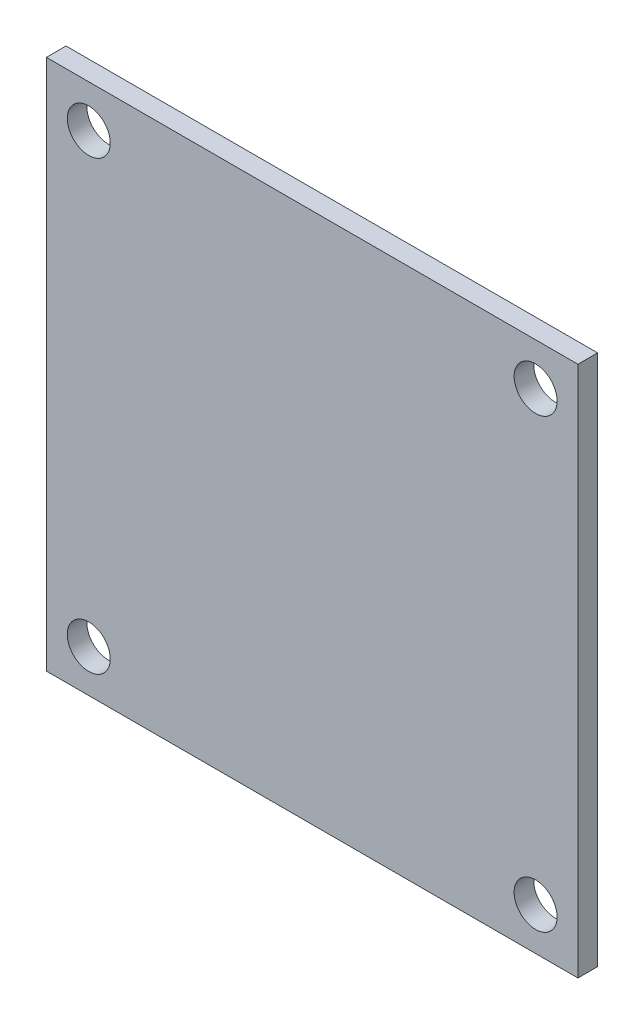
ISO-10303-21;
HEADER;
FILE_DESCRIPTION(('STEP AP214'),'2;1');
FILE_NAME('part.step','',(''),(''),'','','');
FILE_SCHEMA(('AUTOMOTIVE_DESIGN { 1 0 10303 214 1 1 1 1 }'));
ENDSEC;
DATA;
#1=APPLICATION_CONTEXT('core data for automotive mechanical design processes');
#2=APPLICATION_PROTOCOL_DEFINITION('international standard','automotive_design',2000,#1);
#3=PRODUCT_CONTEXT('',#1,'mechanical');
#4=PRODUCT('Part','Part','',(#3));
#5=PRODUCT_RELATED_PRODUCT_CATEGORY('part','',(#4));
#6=PRODUCT_DEFINITION_FORMATION('','',#4);
#7=PRODUCT_DEFINITION_CONTEXT('part definition',#1,'design');
#8=PRODUCT_DEFINITION('design','',#6,#7);
#9=PRODUCT_DEFINITION_SHAPE('','',#8);
#10=(LENGTH_UNIT() NAMED_UNIT(*) SI_UNIT(.MILLI.,.METRE.));
#11=(NAMED_UNIT(*) PLANE_ANGLE_UNIT() SI_UNIT($,.RADIAN.));
#12=(NAMED_UNIT(*) SI_UNIT($,.STERADIAN.) SOLID_ANGLE_UNIT());
#13=UNCERTAINTY_MEASURE_WITH_UNIT(LENGTH_MEASURE(1.E-05),#10,'distance_accuracy_value','');
#14=(GEOMETRIC_REPRESENTATION_CONTEXT(3) GLOBAL_UNCERTAINTY_ASSIGNED_CONTEXT((#13)) GLOBAL_UNIT_ASSIGNED_CONTEXT((#10,
#11,#12)) REPRESENTATION_CONTEXT('',''));
#15=CARTESIAN_POINT('',(0.,0.,0.));
#16=DIRECTION('',(0.,0.,1.));
#17=DIRECTION('',(1.,0.,0.));
#18=AXIS2_PLACEMENT_3D('',#15,#16,#17);
#19=CARTESIAN_POINT('',(0.,0.,1.6));
#20=DIRECTION('',(1.,0.,0.));
#21=DIRECTION('',(0.,0.,-1.));
#22=AXIS2_PLACEMENT_3D('',#19,#20,#21);
#23=PLANE('',#22);
#24=DIRECTION('',(0.,-1.,0.));
#25=VECTOR('',#24,1.);
#26=CARTESIAN_POINT('',(0.,0.,0.));
#27=LINE('',#26,#25);
#28=CARTESIAN_POINT('',(0.,43.3,0.));
#29=VERTEX_POINT('',#28);
#30=CARTESIAN_POINT('',(0.,0.,0.));
#31=VERTEX_POINT('',#30);
#32=EDGE_CURVE('E96',#29,#31,#27,.T.);
#33=ORIENTED_EDGE('',*,*,#32,.T.);
#34=DIRECTION('',(0.,0.,-1.));
#35=VECTOR('',#34,1.);
#36=CARTESIAN_POINT('',(0.,0.,1.6));
#37=LINE('',#36,#35);
#38=CARTESIAN_POINT('',(0.,0.,1.6));
#39=VERTEX_POINT('',#38);
#40=EDGE_CURVE('E11',#39,#31,#37,.T.);
#41=ORIENTED_EDGE('',*,*,#40,.F.);
#42=DIRECTION('',(0.,-1.,0.));
#43=VECTOR('',#42,1.);
#44=CARTESIAN_POINT('',(0.,0.,1.6));
#45=LINE('',#44,#43);
#46=CARTESIAN_POINT('',(0.,43.3,1.6));
#47=VERTEX_POINT('',#46);
#48=EDGE_CURVE('E84',#47,#39,#45,.T.);
#49=ORIENTED_EDGE('',*,*,#48,.F.);
#50=DIRECTION('',(0.,0.,-1.));
#51=VECTOR('',#50,1.);
#52=CARTESIAN_POINT('',(0.,43.3,1.6));
#53=LINE('',#52,#51);
#54=EDGE_CURVE('E92',#47,#29,#53,.T.);
#55=ORIENTED_EDGE('',*,*,#54,.T.);
#56=EDGE_LOOP('',(#33,#41,#49,#55));
#57=FACE_BOUND('',#56,.T.);
#58=ADVANCED_FACE('F33',(#57),#23,.F.);
#59=CARTESIAN_POINT('',(0.,0.,1.6));
#60=DIRECTION('',(0.,1.,0.));
#61=DIRECTION('',(0.,0.,1.));
#62=AXIS2_PLACEMENT_3D('',#59,#60,#61);
#63=PLANE('',#62);
#64=DIRECTION('',(1.,0.,0.));
#65=VECTOR('',#64,1.);
#66=CARTESIAN_POINT('',(0.,0.,0.));
#67=LINE('',#66,#65);
#68=CARTESIAN_POINT('',(43.3,0.,0.));
#69=VERTEX_POINT('',#68);
#70=EDGE_CURVE('E88',#31,#69,#67,.T.);
#71=ORIENTED_EDGE('',*,*,#70,.T.);
#72=DIRECTION('',(0.,0.,-1.));
#73=VECTOR('',#72,1.);
#74=CARTESIAN_POINT('',(43.3,0.,1.6));
#75=LINE('',#74,#73);
#76=CARTESIAN_POINT('',(43.3,0.,1.6));
#77=VERTEX_POINT('',#76);
#78=EDGE_CURVE('E41',#77,#69,#75,.T.);
#79=ORIENTED_EDGE('',*,*,#78,.F.);
#80=DIRECTION('',(1.,0.,0.));
#81=VECTOR('',#80,1.);
#82=CARTESIAN_POINT('',(0.,0.,1.6));
#83=LINE('',#82,#81);
#84=EDGE_CURVE('E79',#39,#77,#83,.T.);
#85=ORIENTED_EDGE('',*,*,#84,.F.);
#86=ORIENTED_EDGE('',*,*,#40,.T.);
#87=EDGE_LOOP('',(#71,#79,#85,#86));
#88=FACE_BOUND('',#87,.T.);
#89=ADVANCED_FACE('F87',(#88),#63,.F.);
#90=CARTESIAN_POINT('',(43.3,0.,1.6));
#91=DIRECTION('',(-1.,0.,0.));
#92=DIRECTION('',(0.,0.,1.));
#93=AXIS2_PLACEMENT_3D('',#90,#91,#92);
#94=PLANE('',#93);
#95=DIRECTION('',(0.,1.,0.));
#96=VECTOR('',#95,1.);
#97=CARTESIAN_POINT('',(43.3,0.,0.));
#98=LINE('',#97,#96);
#99=CARTESIAN_POINT('',(43.3,43.3,0.));
#100=VERTEX_POINT('',#99);
#101=EDGE_CURVE('E66',#69,#100,#98,.T.);
#102=ORIENTED_EDGE('',*,*,#101,.T.);
#103=DIRECTION('',(0.,0.,-1.));
#104=VECTOR('',#103,1.);
#105=CARTESIAN_POINT('',(43.3,43.3,1.6));
#106=LINE('',#105,#104);
#107=CARTESIAN_POINT('',(43.3,43.3,1.6));
#108=VERTEX_POINT('',#107);
#109=EDGE_CURVE('E89',#108,#100,#106,.T.);
#110=ORIENTED_EDGE('',*,*,#109,.F.);
#111=DIRECTION('',(0.,1.,0.));
#112=VECTOR('',#111,1.);
#113=CARTESIAN_POINT('',(43.3,0.,1.6));
#114=LINE('',#113,#112);
#115=EDGE_CURVE('E82',#77,#108,#114,.T.);
#116=ORIENTED_EDGE('',*,*,#115,.F.);
#117=ORIENTED_EDGE('',*,*,#78,.T.);
#118=EDGE_LOOP('',(#102,#110,#116,#117));
#119=FACE_BOUND('',#118,.T.);
#120=ADVANCED_FACE('F90',(#119),#94,.F.);
#121=CARTESIAN_POINT('',(0.,43.3,1.6));
#122=DIRECTION('',(0.,-1.,0.));
#123=DIRECTION('',(0.,0.,-1.));
#124=AXIS2_PLACEMENT_3D('',#121,#122,#123);
#125=PLANE('',#124);
#126=DIRECTION('',(-1.,0.,0.));
#127=VECTOR('',#126,1.);
#128=CARTESIAN_POINT('',(0.,43.3,0.));
#129=LINE('',#128,#127);
#130=EDGE_CURVE('E72',#100,#29,#129,.T.);
#131=ORIENTED_EDGE('',*,*,#130,.T.);
#132=ORIENTED_EDGE('',*,*,#54,.F.);
#133=DIRECTION('',(-1.,0.,0.));
#134=VECTOR('',#133,1.);
#135=CARTESIAN_POINT('',(0.,43.3,1.6));
#136=LINE('',#135,#134);
#137=EDGE_CURVE('E49',#108,#47,#136,.T.);
#138=ORIENTED_EDGE('',*,*,#137,.F.);
#139=ORIENTED_EDGE('',*,*,#109,.T.);
#140=EDGE_LOOP('',(#131,#132,#138,#139));
#141=FACE_BOUND('',#140,.T.);
#142=ADVANCED_FACE('F104',(#141),#125,.F.);
#143=CARTESIAN_POINT('',(0.,0.,1.6));
#144=DIRECTION('',(0.,0.,-1.));
#145=DIRECTION('',(-1.,0.,0.));
#146=AXIS2_PLACEMENT_3D('',#143,#144,#145);
#147=PLANE('',#146);
#148=CARTESIAN_POINT('',(3.45,3.45,1.6));
#149=DIRECTION('',(0.,0.,-1.));
#150=DIRECTION('',(1.,0.,0.));
#151=AXIS2_PLACEMENT_3D('',#148,#149,#150);
#152=CIRCLE('',#151,1.75);
#153=CARTESIAN_POINT('',(5.2,3.45,1.6));
#154=VERTEX_POINT('',#153);
#155=EDGE_CURVE('E128',#154,#154,#152,.T.);
#156=ORIENTED_EDGE('',*,*,#155,.T.);
#157=EDGE_LOOP('',(#156));
#158=FACE_BOUND('',#157,.T.);
#159=CARTESIAN_POINT('',(39.85,3.45,1.6));
#160=DIRECTION('',(0.,0.,1.));
#161=DIRECTION('',(-1.,0.,0.));
#162=AXIS2_PLACEMENT_3D('',#159,#160,#161);
#163=CIRCLE('',#162,1.75);
#164=CARTESIAN_POINT('',(38.1,3.45,1.6));
#165=VERTEX_POINT('',#164);
#166=EDGE_CURVE('E122',#165,#165,#163,.T.);
#167=ORIENTED_EDGE('',*,*,#166,.F.);
#168=EDGE_LOOP('',(#167));
#169=FACE_BOUND('',#168,.T.);
#170=CARTESIAN_POINT('',(39.85,39.85,1.6));
#171=DIRECTION('',(0.,0.,-1.));
#172=DIRECTION('',(-1.,0.,0.));
#173=AXIS2_PLACEMENT_3D('',#170,#171,#172);
#174=CIRCLE('',#173,1.75);
#175=CARTESIAN_POINT('',(38.1,39.85,1.6));
#176=VERTEX_POINT('',#175);
#177=EDGE_CURVE('E116',#176,#176,#174,.T.);
#178=ORIENTED_EDGE('',*,*,#177,.T.);
#179=EDGE_LOOP('',(#178));
#180=FACE_BOUND('',#179,.T.);
#181=CARTESIAN_POINT('',(3.45,39.85,1.6));
#182=DIRECTION('',(0.,0.,1.));
#183=DIRECTION('',(1.,0.,0.));
#184=AXIS2_PLACEMENT_3D('',#181,#182,#183);
#185=CIRCLE('',#184,1.75);
#186=CARTESIAN_POINT('',(5.2,39.85,1.6));
#187=VERTEX_POINT('',#186);
#188=EDGE_CURVE('E110',#187,#187,#185,.T.);
#189=ORIENTED_EDGE('',*,*,#188,.F.);
#190=EDGE_LOOP('',(#189));
#191=FACE_BOUND('',#190,.T.);
#192=ORIENTED_EDGE('',*,*,#48,.T.);
#193=ORIENTED_EDGE('',*,*,#84,.T.);
#194=ORIENTED_EDGE('',*,*,#115,.T.);
#195=ORIENTED_EDGE('',*,*,#137,.T.);
#196=EDGE_LOOP('',(#192,#193,#194,#195));
#197=FACE_BOUND('',#196,.T.);
#198=ADVANCED_FACE('F80',(#158,#169,#180,#191,#197),#147,.F.);
#199=CARTESIAN_POINT('',(0.,0.,0.));
#200=DIRECTION('',(0.,0.,-1.));
#201=DIRECTION('',(-1.,0.,0.));
#202=AXIS2_PLACEMENT_3D('',#199,#200,#201);
#203=PLANE('',#202);
#204=CARTESIAN_POINT('',(3.45,3.45,0.));
#205=DIRECTION('',(0.,0.,-1.));
#206=DIRECTION('',(1.,0.,0.));
#207=AXIS2_PLACEMENT_3D('',#204,#205,#206);
#208=CIRCLE('',#207,1.75);
#209=CARTESIAN_POINT('',(5.2,3.45,0.));
#210=VERTEX_POINT('',#209);
#211=EDGE_CURVE('E125',#210,#210,#208,.T.);
#212=ORIENTED_EDGE('',*,*,#211,.F.);
#213=EDGE_LOOP('',(#212));
#214=FACE_BOUND('',#213,.T.);
#215=CARTESIAN_POINT('',(39.85,3.45,0.));
#216=DIRECTION('',(0.,0.,1.));
#217=DIRECTION('',(-1.,0.,0.));
#218=AXIS2_PLACEMENT_3D('',#215,#216,#217);
#219=CIRCLE('',#218,1.75);
#220=CARTESIAN_POINT('',(38.1,3.45,0.));
#221=VERTEX_POINT('',#220);
#222=EDGE_CURVE('E119',#221,#221,#219,.T.);
#223=ORIENTED_EDGE('',*,*,#222,.T.);
#224=EDGE_LOOP('',(#223));
#225=FACE_BOUND('',#224,.T.);
#226=CARTESIAN_POINT('',(39.85,39.85,0.));
#227=DIRECTION('',(0.,0.,-1.));
#228=DIRECTION('',(-1.,0.,0.));
#229=AXIS2_PLACEMENT_3D('',#226,#227,#228);
#230=CIRCLE('',#229,1.75);
#231=CARTESIAN_POINT('',(38.1,39.85,0.));
#232=VERTEX_POINT('',#231);
#233=EDGE_CURVE('E113',#232,#232,#230,.T.);
#234=ORIENTED_EDGE('',*,*,#233,.F.);
#235=EDGE_LOOP('',(#234));
#236=FACE_BOUND('',#235,.T.);
#237=CARTESIAN_POINT('',(3.45,39.85,0.));
#238=DIRECTION('',(0.,0.,1.));
#239=DIRECTION('',(1.,0.,0.));
#240=AXIS2_PLACEMENT_3D('',#237,#238,#239);
#241=CIRCLE('',#240,1.75);
#242=CARTESIAN_POINT('',(5.2,39.85,0.));
#243=VERTEX_POINT('',#242);
#244=EDGE_CURVE('E99',#243,#243,#241,.T.);
#245=ORIENTED_EDGE('',*,*,#244,.T.);
#246=EDGE_LOOP('',(#245));
#247=FACE_BOUND('',#246,.T.);
#248=ORIENTED_EDGE('',*,*,#32,.F.);
#249=ORIENTED_EDGE('',*,*,#130,.F.);
#250=ORIENTED_EDGE('',*,*,#101,.F.);
#251=ORIENTED_EDGE('',*,*,#70,.F.);
#252=EDGE_LOOP('',(#248,#249,#250,#251));
#253=FACE_BOUND('',#252,.T.);
#254=ADVANCED_FACE('F107',(#214,#225,#236,#247,#253),#203,.T.);
#255=CARTESIAN_POINT('',(3.45,39.85,0.));
#256=DIRECTION('',(0.,0.,1.));
#257=DIRECTION('',(1.,0.,0.));
#258=AXIS2_PLACEMENT_3D('',#255,#256,#257);
#259=CYLINDRICAL_SURFACE('',#258,1.75);
#260=ORIENTED_EDGE('',*,*,#244,.F.);
#261=EDGE_LOOP('',(#260));
#262=FACE_BOUND('',#261,.T.);
#263=ORIENTED_EDGE('',*,*,#188,.T.);
#264=EDGE_LOOP('',(#263));
#265=FACE_BOUND('',#264,.T.);
#266=ADVANCED_FACE('F139',(#262,#265),#259,.F.);
#267=CARTESIAN_POINT('',(39.85,39.85,0.));
#268=DIRECTION('',(0.,0.,1.));
#269=DIRECTION('',(1.,0.,0.));
#270=AXIS2_PLACEMENT_3D('',#267,#268,#269);
#271=CYLINDRICAL_SURFACE('',#270,1.75);
#272=ORIENTED_EDGE('',*,*,#233,.T.);
#273=EDGE_LOOP('',(#272));
#274=FACE_BOUND('',#273,.T.);
#275=ORIENTED_EDGE('',*,*,#177,.F.);
#276=EDGE_LOOP('',(#275));
#277=FACE_BOUND('',#276,.T.);
#278=ADVANCED_FACE('F149',(#274,#277),#271,.F.);
#279=CARTESIAN_POINT('',(39.85,3.45,0.));
#280=DIRECTION('',(0.,0.,1.));
#281=DIRECTION('',(1.,0.,0.));
#282=AXIS2_PLACEMENT_3D('',#279,#280,#281);
#283=CYLINDRICAL_SURFACE('',#282,1.75);
#284=ORIENTED_EDGE('',*,*,#222,.F.);
#285=EDGE_LOOP('',(#284));
#286=FACE_BOUND('',#285,.T.);
#287=ORIENTED_EDGE('',*,*,#166,.T.);
#288=EDGE_LOOP('',(#287));
#289=FACE_BOUND('',#288,.T.);
#290=ADVANCED_FACE('F191',(#286,#289),#283,.F.);
#291=CARTESIAN_POINT('',(3.45,3.45,0.));
#292=DIRECTION('',(0.,0.,1.));
#293=DIRECTION('',(1.,0.,0.));
#294=AXIS2_PLACEMENT_3D('',#291,#292,#293);
#295=CYLINDRICAL_SURFACE('',#294,1.75);
#296=ORIENTED_EDGE('',*,*,#211,.T.);
#297=EDGE_LOOP('',(#296));
#298=FACE_BOUND('',#297,.T.);
#299=ORIENTED_EDGE('',*,*,#155,.F.);
#300=EDGE_LOOP('',(#299));
#301=FACE_BOUND('',#300,.T.);
#302=ADVANCED_FACE('F134',(#298,#301),#295,.F.);
#303=CLOSED_SHELL('',(#58,#89,#120,#142,#198,#254,#266,#278,#290,#302));
#304=MANIFOLD_SOLID_BREP('B2',#303);
#305=ADVANCED_BREP_SHAPE_REPRESENTATION('',(#18,#304),#14);
#306=SHAPE_DEFINITION_REPRESENTATION(#9,#305);
ENDSEC;
END-ISO-10303-21;
